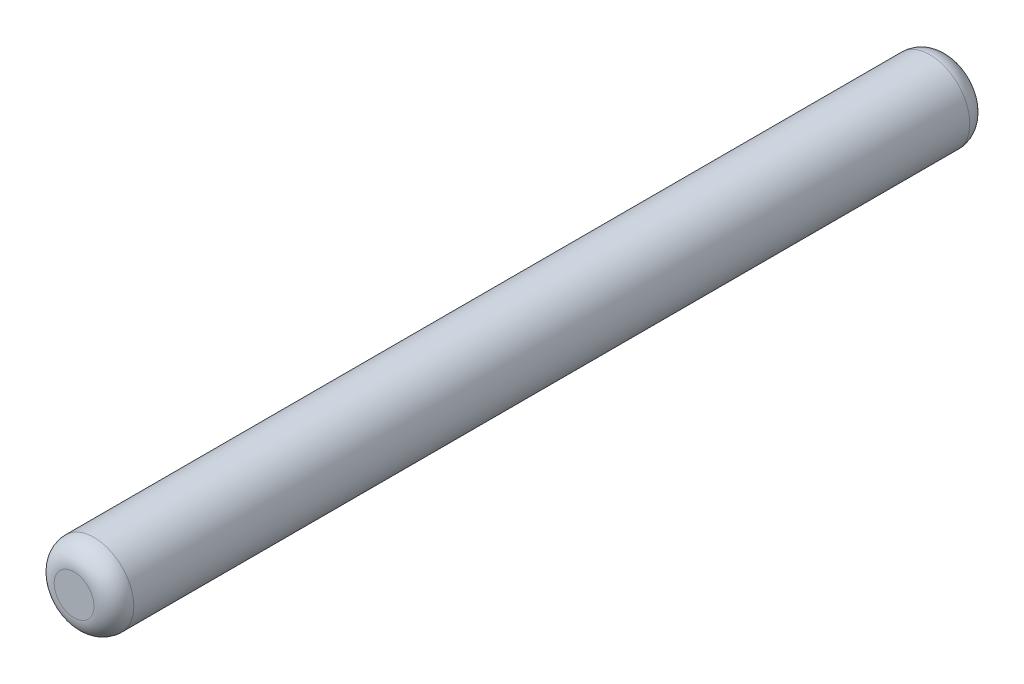
ISO-10303-21;
HEADER;
FILE_DESCRIPTION(('STEP AP214'),'2;1');
FILE_NAME('part.step','',(''),(''),'','','');
FILE_SCHEMA(('AUTOMOTIVE_DESIGN { 1 0 10303 214 1 1 1 1 }'));
ENDSEC;
DATA;
#1=APPLICATION_CONTEXT('core data for automotive mechanical design processes');
#2=APPLICATION_PROTOCOL_DEFINITION('international standard','automotive_design',2000,#1);
#3=PRODUCT_CONTEXT('',#1,'mechanical');
#4=PRODUCT('Part','Part','',(#3));
#5=PRODUCT_RELATED_PRODUCT_CATEGORY('part','',(#4));
#6=PRODUCT_DEFINITION_FORMATION('','',#4);
#7=PRODUCT_DEFINITION_CONTEXT('part definition',#1,'design');
#8=PRODUCT_DEFINITION('design','',#6,#7);
#9=PRODUCT_DEFINITION_SHAPE('','',#8);
#10=(LENGTH_UNIT() NAMED_UNIT(*) SI_UNIT(.MILLI.,.METRE.));
#11=(NAMED_UNIT(*) PLANE_ANGLE_UNIT() SI_UNIT($,.RADIAN.));
#12=(NAMED_UNIT(*) SI_UNIT($,.STERADIAN.) SOLID_ANGLE_UNIT());
#13=UNCERTAINTY_MEASURE_WITH_UNIT(LENGTH_MEASURE(1.E-05),#10,'distance_accuracy_value','');
#14=(GEOMETRIC_REPRESENTATION_CONTEXT(3) GLOBAL_UNCERTAINTY_ASSIGNED_CONTEXT((#13)) GLOBAL_UNIT_ASSIGNED_CONTEXT((#10,
#11,#12)) REPRESENTATION_CONTEXT('',''));
#15=CARTESIAN_POINT('',(0.,0.,0.));
#16=DIRECTION('',(0.,0.,1.));
#17=DIRECTION('',(1.,0.,0.));
#18=AXIS2_PLACEMENT_3D('',#15,#16,#17);
#19=CARTESIAN_POINT('',(0.,0.,-11.));
#20=DIRECTION('',(0.,0.,1.));
#21=DIRECTION('',(1.,0.,0.));
#22=AXIS2_PLACEMENT_3D('',#19,#20,#21);
#23=PLANE('',#22);
#24=CARTESIAN_POINT('',(0.,0.,-11.));
#25=DIRECTION('',(0.,0.,1.));
#26=DIRECTION('',(0.,-1.,0.));
#27=AXIS2_PLACEMENT_3D('',#24,#25,#26);
#28=CIRCLE('',#27,0.5);
#29=CARTESIAN_POINT('',(0.,-0.500000000000001,-11.));
#30=VERTEX_POINT('',#29);
#31=EDGE_CURVE('E18',#30,#30,#28,.T.);
#32=ORIENTED_EDGE('',*,*,#31,.F.);
#33=EDGE_LOOP('',(#32));
#34=FACE_BOUND('',#33,.T.);
#35=ADVANCED_FACE('F14',(#34),#23,.F.);
#36=CARTESIAN_POINT('',(0.,0.,11.));
#37=DIRECTION('',(0.,0.,1.));
#38=DIRECTION('',(1.,0.,0.));
#39=AXIS2_PLACEMENT_3D('',#36,#37,#38);
#40=PLANE('',#39);
#41=CARTESIAN_POINT('',(0.,0.,11.));
#42=DIRECTION('',(0.,0.,1.));
#43=DIRECTION('',(0.,-1.,0.));
#44=AXIS2_PLACEMENT_3D('',#41,#42,#43);
#45=CIRCLE('',#44,0.5);
#46=CARTESIAN_POINT('',(0.,-0.5,11.));
#47=VERTEX_POINT('',#46);
#48=EDGE_CURVE('E27',#47,#47,#45,.F.);
#49=ORIENTED_EDGE('',*,*,#48,.F.);
#50=EDGE_LOOP('',(#49));
#51=FACE_BOUND('',#50,.T.);
#52=ADVANCED_FACE('F38',(#51),#40,.T.);
#53=CARTESIAN_POINT('',(0.,0.,-10.5));
#54=DIRECTION('',(0.,0.,1.));
#55=DIRECTION('',(0.,-1.,0.));
#56=AXIS2_PLACEMENT_3D('',#53,#54,#55);
#57=DEGENERATE_TOROIDAL_SURFACE('',#56,0.499999999999991,0.500000000000005,.T.);
#58=CARTESIAN_POINT('',(0.,0.,-10.5));
#59=DIRECTION('',(0.,0.,1.));
#60=DIRECTION('',(1.,0.,0.));
#61=AXIS2_PLACEMENT_3D('',#58,#59,#60);
#62=CIRCLE('',#61,1.);
#63=CARTESIAN_POINT('',(1.,0.,-10.5));
#64=VERTEX_POINT('',#63);
#65=EDGE_CURVE('E22',#64,#64,#62,.T.);
#66=ORIENTED_EDGE('',*,*,#65,.F.);
#67=EDGE_LOOP('',(#66));
#68=FACE_BOUND('',#67,.T.);
#69=ORIENTED_EDGE('',*,*,#31,.T.);
#70=EDGE_LOOP('',(#69));
#71=FACE_BOUND('',#70,.T.);
#72=ADVANCED_FACE('F35',(#68,#71),#57,.T.);
#73=CARTESIAN_POINT('',(0.,0.,10.5));
#74=DIRECTION('',(0.,0.,1.));
#75=DIRECTION('',(0.,-1.,0.));
#76=AXIS2_PLACEMENT_3D('',#73,#74,#75);
#77=DEGENERATE_TOROIDAL_SURFACE('',#76,0.499999999999997,0.500000000000002,.T.);
#78=ORIENTED_EDGE('',*,*,#48,.T.);
#79=EDGE_LOOP('',(#78));
#80=FACE_BOUND('',#79,.T.);
#81=CARTESIAN_POINT('',(0.,0.,10.5));
#82=DIRECTION('',(0.,0.,1.));
#83=DIRECTION('',(1.,0.,0.));
#84=AXIS2_PLACEMENT_3D('',#81,#82,#83);
#85=CIRCLE('',#84,1.);
#86=CARTESIAN_POINT('',(1.,0.,10.5));
#87=VERTEX_POINT('',#86);
#88=EDGE_CURVE('E10',#87,#87,#85,.F.);
#89=ORIENTED_EDGE('',*,*,#88,.F.);
#90=EDGE_LOOP('',(#89));
#91=FACE_BOUND('',#90,.T.);
#92=ADVANCED_FACE('F16',(#80,#91),#77,.T.);
#93=CARTESIAN_POINT('',(0.,0.,-11.));
#94=DIRECTION('',(0.,0.,1.));
#95=DIRECTION('',(1.,0.,0.));
#96=AXIS2_PLACEMENT_3D('',#93,#94,#95);
#97=CYLINDRICAL_SURFACE('',#96,1.);
#98=ORIENTED_EDGE('',*,*,#88,.T.);
#99=EDGE_LOOP('',(#98));
#100=FACE_BOUND('',#99,.T.);
#101=ORIENTED_EDGE('',*,*,#65,.T.);
#102=EDGE_LOOP('',(#101));
#103=FACE_BOUND('',#102,.T.);
#104=ADVANCED_FACE('F46',(#100,#103),#97,.T.);
#105=CLOSED_SHELL('',(#35,#52,#72,#92,#104));
#106=MANIFOLD_SOLID_BREP('B1',#105);
#107=ADVANCED_BREP_SHAPE_REPRESENTATION('',(#18,#106),#14);
#108=SHAPE_DEFINITION_REPRESENTATION(#9,#107);
ENDSEC;
END-ISO-10303-21;
